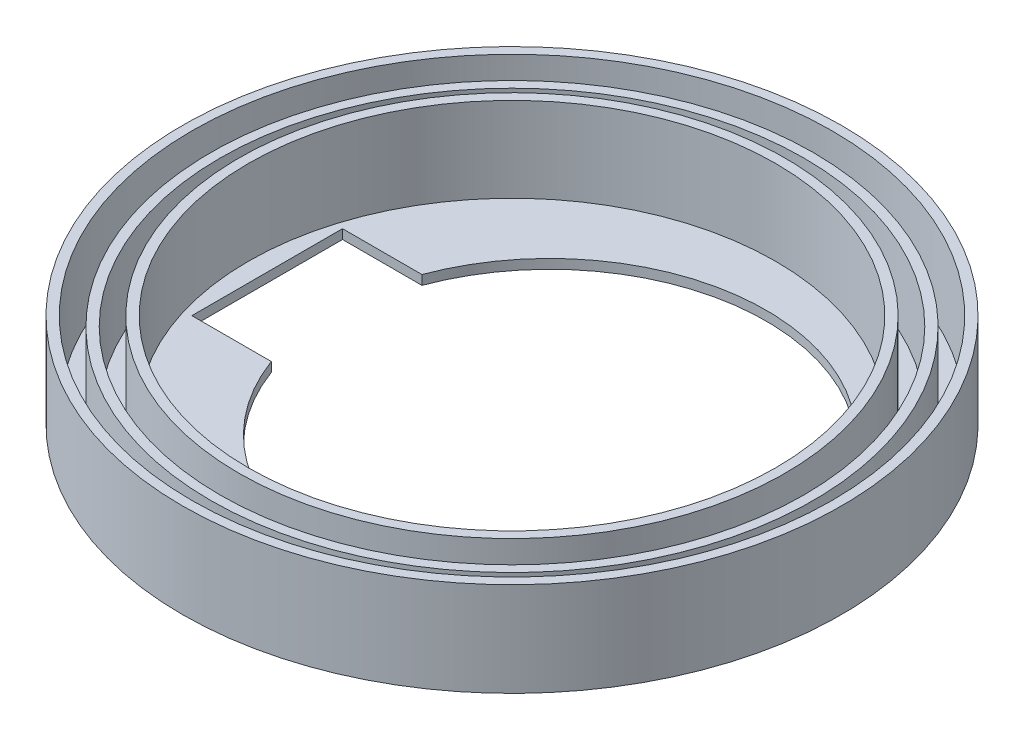
ISO-10303-21;
HEADER;
FILE_DESCRIPTION(('STEP AP214'),'2;1');
FILE_NAME('part.step','',(''),(''),'','','');
FILE_SCHEMA(('AUTOMOTIVE_DESIGN { 1 0 10303 214 1 1 1 1 }'));
ENDSEC;
DATA;
#1=APPLICATION_CONTEXT('core data for automotive mechanical design processes');
#2=APPLICATION_PROTOCOL_DEFINITION('international standard','automotive_design',2000,#1);
#3=PRODUCT_CONTEXT('',#1,'mechanical');
#4=PRODUCT('Part','Part','',(#3));
#5=PRODUCT_RELATED_PRODUCT_CATEGORY('part','',(#4));
#6=PRODUCT_DEFINITION_FORMATION('','',#4);
#7=PRODUCT_DEFINITION_CONTEXT('part definition',#1,'design');
#8=PRODUCT_DEFINITION('design','',#6,#7);
#9=PRODUCT_DEFINITION_SHAPE('','',#8);
#10=(LENGTH_UNIT() NAMED_UNIT(*) SI_UNIT(.MILLI.,.METRE.));
#11=(NAMED_UNIT(*) PLANE_ANGLE_UNIT() SI_UNIT($,.RADIAN.));
#12=(NAMED_UNIT(*) SI_UNIT($,.STERADIAN.) SOLID_ANGLE_UNIT());
#13=UNCERTAINTY_MEASURE_WITH_UNIT(LENGTH_MEASURE(1.E-05),#10,'distance_accuracy_value','');
#14=(GEOMETRIC_REPRESENTATION_CONTEXT(3) GLOBAL_UNCERTAINTY_ASSIGNED_CONTEXT((#13)) GLOBAL_UNIT_ASSIGNED_CONTEXT((#10,
#11,#12)) REPRESENTATION_CONTEXT('',''));
#15=CARTESIAN_POINT('',(0.,0.,0.));
#16=DIRECTION('',(0.,0.,1.));
#17=DIRECTION('',(1.,0.,0.));
#18=AXIS2_PLACEMENT_3D('',#15,#16,#17);
#19=CARTESIAN_POINT('',(0.,0.5,0.));
#20=DIRECTION('',(0.,1.,0.));
#21=DIRECTION('',(0.,0.,1.));
#22=AXIS2_PLACEMENT_3D('',#19,#20,#21);
#23=PLANE('',#22);
#24=CARTESIAN_POINT('',(0.,0.5,0.));
#25=DIRECTION('',(0.,1.,0.));
#26=DIRECTION('',(0.,0.,1.));
#27=AXIS2_PLACEMENT_3D('',#24,#25,#26);
#28=CIRCLE('',#27,16.);
#29=CARTESIAN_POINT('',(0.,0.5,16.));
#30=VERTEX_POINT('',#29);
#31=EDGE_CURVE('E101',#30,#30,#28,.F.);
#32=ORIENTED_EDGE('',*,*,#31,.T.);
#33=EDGE_LOOP('',(#32));
#34=FACE_BOUND('',#33,.T.);
#35=CARTESIAN_POINT('',(0.,0.5,0.));
#36=DIRECTION('',(0.,1.,0.));
#37=DIRECTION('',(0.,0.,1.));
#38=AXIS2_PLACEMENT_3D('',#35,#36,#37);
#39=CIRCLE('',#38,17.);
#40=CARTESIAN_POINT('',(0.,0.5,17.));
#41=VERTEX_POINT('',#40);
#42=EDGE_CURVE('E12',#41,#41,#39,.F.);
#43=ORIENTED_EDGE('',*,*,#42,.F.);
#44=EDGE_LOOP('',(#43));
#45=FACE_BOUND('',#44,.T.);
#46=ADVANCED_FACE('F39',(#34,#45),#23,.T.);
#47=DIRECTION('',(0.,0.,-1.));
#48=VECTOR('',#47,1.);
#49=CARTESIAN_POINT('',(-13.,0.5,0.));
#50=LINE('',#49,#48);
#51=CARTESIAN_POINT('',(-13.,0.5,4.));
#52=VERTEX_POINT('',#51);
#53=CARTESIAN_POINT('',(-13.,0.5,-4.));
#54=VERTEX_POINT('',#53);
#55=EDGE_CURVE('E112',#52,#54,#50,.T.);
#56=ORIENTED_EDGE('',*,*,#55,.T.);
#57=DIRECTION('',(1.,0.,0.));
#58=VECTOR('',#57,1.);
#59=CARTESIAN_POINT('',(0.,0.5,-4.));
#60=LINE('',#59,#58);
#61=CARTESIAN_POINT('',(-8.78192932642392,0.5,-4.));
#62=VERTEX_POINT('',#61);
#63=EDGE_CURVE('E84',#54,#62,#60,.T.);
#64=ORIENTED_EDGE('',*,*,#63,.T.);
#65=CARTESIAN_POINT('',(2.,0.5,0.));
#66=DIRECTION('',(0.,1.,0.));
#67=DIRECTION('',(0.,0.,1.));
#68=AXIS2_PLACEMENT_3D('',#65,#66,#67);
#69=CIRCLE('',#68,11.5);
#70=CARTESIAN_POINT('',(-8.78192932642392,0.5,4.));
#71=VERTEX_POINT('',#70);
#72=EDGE_CURVE('E114',#71,#62,#69,.T.);
#73=ORIENTED_EDGE('',*,*,#72,.F.);
#74=DIRECTION('',(-1.,0.,0.));
#75=VECTOR('',#74,1.);
#76=CARTESIAN_POINT('',(0.,0.5,4.));
#77=LINE('',#76,#75);
#78=EDGE_CURVE('E54',#71,#52,#77,.T.);
#79=ORIENTED_EDGE('',*,*,#78,.T.);
#80=EDGE_LOOP('',(#56,#64,#73,#79));
#81=FACE_BOUND('',#80,.T.);
#82=CARTESIAN_POINT('',(0.,0.5,0.));
#83=DIRECTION('',(0.,1.,0.));
#84=DIRECTION('',(0.,0.,1.));
#85=AXIS2_PLACEMENT_3D('',#82,#83,#84);
#86=CIRCLE('',#85,14.);
#87=CARTESIAN_POINT('',(0.,0.5,14.));
#88=VERTEX_POINT('',#87);
#89=EDGE_CURVE('E47',#88,#88,#86,.F.);
#90=ORIENTED_EDGE('',*,*,#89,.F.);
#91=EDGE_LOOP('',(#90));
#92=FACE_BOUND('',#91,.T.);
#93=ADVANCED_FACE('F169',(#81,#92),#23,.T.);
#94=CARTESIAN_POINT('',(0.,0.5,0.));
#95=DIRECTION('',(0.,1.,0.));
#96=DIRECTION('',(0.,0.,1.));
#97=AXIS2_PLACEMENT_3D('',#94,#95,#96);
#98=CIRCLE('',#97,14.5);
#99=CARTESIAN_POINT('',(0.,0.5,14.5));
#100=VERTEX_POINT('',#99);
#101=EDGE_CURVE('E137',#100,#100,#98,.T.);
#102=ORIENTED_EDGE('',*,*,#101,.F.);
#103=EDGE_LOOP('',(#102));
#104=FACE_BOUND('',#103,.T.);
#105=CARTESIAN_POINT('',(0.,0.5,0.));
#106=DIRECTION('',(0.,1.,0.));
#107=DIRECTION('',(0.,0.,1.));
#108=AXIS2_PLACEMENT_3D('',#105,#106,#107);
#109=CIRCLE('',#108,15.5);
#110=CARTESIAN_POINT('',(0.,0.5,15.5));
#111=VERTEX_POINT('',#110);
#112=EDGE_CURVE('E123',#111,#111,#109,.F.);
#113=ORIENTED_EDGE('',*,*,#112,.F.);
#114=EDGE_LOOP('',(#113));
#115=FACE_BOUND('',#114,.T.);
#116=ADVANCED_FACE('F172',(#104,#115),#23,.T.);
#117=CARTESIAN_POINT('',(0.,0.,0.));
#118=DIRECTION('',(0.,1.,0.));
#119=DIRECTION('',(0.,0.,1.));
#120=AXIS2_PLACEMENT_3D('',#117,#118,#119);
#121=PLANE('',#120);
#122=CARTESIAN_POINT('',(0.,0.,0.));
#123=DIRECTION('',(0.,1.,0.));
#124=DIRECTION('',(0.,0.,1.));
#125=AXIS2_PLACEMENT_3D('',#122,#123,#124);
#126=CIRCLE('',#125,17.5);
#127=CARTESIAN_POINT('',(0.,0.,17.5));
#128=VERTEX_POINT('',#127);
#129=EDGE_CURVE('E116',#128,#128,#126,.T.);
#130=ORIENTED_EDGE('',*,*,#129,.F.);
#131=EDGE_LOOP('',(#130));
#132=FACE_BOUND('',#131,.T.);
#133=DIRECTION('',(-1.,0.,0.));
#134=VECTOR('',#133,1.);
#135=CARTESIAN_POINT('',(2.,0.,-4.));
#136=LINE('',#135,#134);
#137=CARTESIAN_POINT('',(-8.78192932642392,0.,-4.));
#138=VERTEX_POINT('',#137);
#139=CARTESIAN_POINT('',(-13.,0.,-4.));
#140=VERTEX_POINT('',#139);
#141=EDGE_CURVE('E83',#138,#140,#136,.T.);
#142=ORIENTED_EDGE('',*,*,#141,.T.);
#143=DIRECTION('',(0.,0.,1.));
#144=VECTOR('',#143,1.);
#145=CARTESIAN_POINT('',(-13.,0.,-4.));
#146=LINE('',#145,#144);
#147=CARTESIAN_POINT('',(-13.,0.,4.));
#148=VERTEX_POINT('',#147);
#149=EDGE_CURVE('E90',#140,#148,#146,.T.);
#150=ORIENTED_EDGE('',*,*,#149,.T.);
#151=DIRECTION('',(1.,0.,0.));
#152=VECTOR('',#151,1.);
#153=CARTESIAN_POINT('',(2.,0.,4.));
#154=LINE('',#153,#152);
#155=CARTESIAN_POINT('',(-8.78192932642391,0.,4.));
#156=VERTEX_POINT('',#155);
#157=EDGE_CURVE('E95',#148,#156,#154,.T.);
#158=ORIENTED_EDGE('',*,*,#157,.T.);
#159=CARTESIAN_POINT('',(2.,0.,0.));
#160=DIRECTION('',(0.,1.,0.));
#161=DIRECTION('',(0.,0.,1.));
#162=AXIS2_PLACEMENT_3D('',#159,#160,#161);
#163=CIRCLE('',#162,11.5);
#164=EDGE_CURVE('E100',#156,#138,#163,.T.);
#165=ORIENTED_EDGE('',*,*,#164,.T.);
#166=EDGE_LOOP('',(#142,#150,#158,#165));
#167=FACE_BOUND('',#166,.T.);
#168=ADVANCED_FACE('F98',(#132,#167),#121,.F.);
#169=CARTESIAN_POINT('',(2.,0.,0.));
#170=DIRECTION('',(0.,1.,0.));
#171=DIRECTION('',(0.,0.,1.));
#172=AXIS2_PLACEMENT_3D('',#169,#170,#171);
#173=CYLINDRICAL_SURFACE('',#172,11.5);
#174=DIRECTION('',(0.,1.,0.));
#175=VECTOR('',#174,1.);
#176=CARTESIAN_POINT('',(-8.78192932642392,0.,-4.));
#177=LINE('',#176,#175);
#178=EDGE_CURVE('E62',#138,#62,#177,.T.);
#179=ORIENTED_EDGE('',*,*,#178,.F.);
#180=ORIENTED_EDGE('',*,*,#164,.F.);
#181=DIRECTION('',(0.,1.,0.));
#182=VECTOR('',#181,1.);
#183=CARTESIAN_POINT('',(-8.78192932642392,0.,4.));
#184=LINE('',#183,#182);
#185=EDGE_CURVE('E121',#71,#156,#184,.F.);
#186=ORIENTED_EDGE('',*,*,#185,.F.);
#187=ORIENTED_EDGE('',*,*,#72,.T.);
#188=EDGE_LOOP('',(#179,#180,#186,#187));
#189=FACE_BOUND('',#188,.T.);
#190=ADVANCED_FACE('F184',(#189),#173,.F.);
#191=CARTESIAN_POINT('',(0.,0.5,0.));
#192=DIRECTION('',(0.,-1.,0.));
#193=DIRECTION('',(0.,0.,-1.));
#194=AXIS2_PLACEMENT_3D('',#191,#192,#193);
#195=CYLINDRICAL_SURFACE('',#194,17.5);
#196=ORIENTED_EDGE('',*,*,#129,.T.);
#197=EDGE_LOOP('',(#196));
#198=FACE_BOUND('',#197,.T.);
#199=CARTESIAN_POINT('',(0.,5.,0.));
#200=DIRECTION('',(0.,1.,0.));
#201=DIRECTION('',(0.,0.,1.));
#202=AXIS2_PLACEMENT_3D('',#199,#200,#201);
#203=CIRCLE('',#202,17.5);
#204=CARTESIAN_POINT('',(0.,5.,17.5));
#205=VERTEX_POINT('',#204);
#206=EDGE_CURVE('E145',#205,#205,#203,.T.);
#207=ORIENTED_EDGE('',*,*,#206,.F.);
#208=EDGE_LOOP('',(#207));
#209=FACE_BOUND('',#208,.T.);
#210=ADVANCED_FACE('F41',(#198,#209),#195,.T.);
#211=CARTESIAN_POINT('',(2.,2.5,-4.));
#212=DIRECTION('',(0.,0.,1.));
#213=DIRECTION('',(1.,0.,0.));
#214=AXIS2_PLACEMENT_3D('',#211,#212,#213);
#215=PLANE('',#214);
#216=DIRECTION('',(0.,-1.,0.));
#217=VECTOR('',#216,1.);
#218=CARTESIAN_POINT('',(-13.,2.5,-4.));
#219=LINE('',#218,#217);
#220=EDGE_CURVE('E79',#54,#140,#219,.T.);
#221=ORIENTED_EDGE('',*,*,#220,.T.);
#222=ORIENTED_EDGE('',*,*,#141,.F.);
#223=ORIENTED_EDGE('',*,*,#178,.T.);
#224=ORIENTED_EDGE('',*,*,#63,.F.);
#225=EDGE_LOOP('',(#221,#222,#223,#224));
#226=FACE_BOUND('',#225,.T.);
#227=ADVANCED_FACE('F81',(#226),#215,.T.);
#228=CARTESIAN_POINT('',(-13.,2.5,-4.));
#229=DIRECTION('',(1.,0.,0.));
#230=DIRECTION('',(0.,0.,-1.));
#231=AXIS2_PLACEMENT_3D('',#228,#229,#230);
#232=PLANE('',#231);
#233=DIRECTION('',(0.,-1.,0.));
#234=VECTOR('',#233,1.);
#235=CARTESIAN_POINT('',(-13.,2.5,4.));
#236=LINE('',#235,#234);
#237=EDGE_CURVE('E87',#52,#148,#236,.T.);
#238=ORIENTED_EDGE('',*,*,#237,.T.);
#239=ORIENTED_EDGE('',*,*,#149,.F.);
#240=ORIENTED_EDGE('',*,*,#220,.F.);
#241=ORIENTED_EDGE('',*,*,#55,.F.);
#242=EDGE_LOOP('',(#238,#239,#240,#241));
#243=FACE_BOUND('',#242,.T.);
#244=ADVANCED_FACE('F91',(#243),#232,.T.);
#245=CARTESIAN_POINT('',(2.,2.5,4.));
#246=DIRECTION('',(0.,0.,-1.));
#247=DIRECTION('',(-1.,0.,0.));
#248=AXIS2_PLACEMENT_3D('',#245,#246,#247);
#249=PLANE('',#248);
#250=ORIENTED_EDGE('',*,*,#185,.T.);
#251=ORIENTED_EDGE('',*,*,#157,.F.);
#252=ORIENTED_EDGE('',*,*,#237,.F.);
#253=ORIENTED_EDGE('',*,*,#78,.F.);
#254=EDGE_LOOP('',(#250,#251,#252,#253));
#255=FACE_BOUND('',#254,.T.);
#256=ADVANCED_FACE('F207',(#255),#249,.T.);
#257=CARTESIAN_POINT('',(0.,4.5,0.));
#258=DIRECTION('',(0.,1.,0.));
#259=DIRECTION('',(0.,0.,1.));
#260=AXIS2_PLACEMENT_3D('',#257,#258,#259);
#261=PLANE('',#260);
#262=CARTESIAN_POINT('',(0.,4.5,0.));
#263=DIRECTION('',(0.,1.,0.));
#264=DIRECTION('',(0.,0.,1.));
#265=AXIS2_PLACEMENT_3D('',#262,#263,#264);
#266=CIRCLE('',#265,16.);
#267=CARTESIAN_POINT('',(0.,4.5,16.));
#268=VERTEX_POINT('',#267);
#269=EDGE_CURVE('E104',#268,#268,#266,.T.);
#270=ORIENTED_EDGE('',*,*,#269,.T.);
#271=EDGE_LOOP('',(#270));
#272=FACE_BOUND('',#271,.T.);
#273=CARTESIAN_POINT('',(0.,4.5,0.));
#274=DIRECTION('',(0.,1.,0.));
#275=DIRECTION('',(0.,0.,1.));
#276=AXIS2_PLACEMENT_3D('',#273,#274,#275);
#277=CIRCLE('',#276,15.5);
#278=CARTESIAN_POINT('',(0.,4.5,15.5));
#279=VERTEX_POINT('',#278);
#280=EDGE_CURVE('E133',#279,#279,#277,.T.);
#281=ORIENTED_EDGE('',*,*,#280,.F.);
#282=EDGE_LOOP('',(#281));
#283=FACE_BOUND('',#282,.T.);
#284=ADVANCED_FACE('F204',(#272,#283),#261,.T.);
#285=CARTESIAN_POINT('',(0.,4.5,0.));
#286=DIRECTION('',(0.,-1.,0.));
#287=DIRECTION('',(0.,0.,-1.));
#288=AXIS2_PLACEMENT_3D('',#285,#286,#287);
#289=CYLINDRICAL_SURFACE('',#288,16.);
#290=ORIENTED_EDGE('',*,*,#31,.F.);
#291=EDGE_LOOP('',(#290));
#292=FACE_BOUND('',#291,.T.);
#293=ORIENTED_EDGE('',*,*,#269,.F.);
#294=EDGE_LOOP('',(#293));
#295=FACE_BOUND('',#294,.T.);
#296=ADVANCED_FACE('F203',(#292,#295),#289,.T.);
#297=CARTESIAN_POINT('',(0.,4.5,0.));
#298=DIRECTION('',(0.,-1.,0.));
#299=DIRECTION('',(0.,0.,-1.));
#300=AXIS2_PLACEMENT_3D('',#297,#298,#299);
#301=CYLINDRICAL_SURFACE('',#300,15.5);
#302=ORIENTED_EDGE('',*,*,#112,.T.);
#303=EDGE_LOOP('',(#302));
#304=FACE_BOUND('',#303,.T.);
#305=ORIENTED_EDGE('',*,*,#280,.T.);
#306=EDGE_LOOP('',(#305));
#307=FACE_BOUND('',#306,.T.);
#308=ADVANCED_FACE('F196',(#304,#307),#301,.F.);
#309=CARTESIAN_POINT('',(0.,5.,0.));
#310=DIRECTION('',(0.,1.,0.));
#311=DIRECTION('',(0.,0.,1.));
#312=AXIS2_PLACEMENT_3D('',#309,#310,#311);
#313=PLANE('',#312);
#314=CARTESIAN_POINT('',(0.,5.,0.));
#315=DIRECTION('',(0.,1.,0.));
#316=DIRECTION('',(0.,0.,1.));
#317=AXIS2_PLACEMENT_3D('',#314,#315,#316);
#318=CIRCLE('',#317,14.5);
#319=CARTESIAN_POINT('',(0.,5.,14.5));
#320=VERTEX_POINT('',#319);
#321=EDGE_CURVE('E136',#320,#320,#318,.T.);
#322=ORIENTED_EDGE('',*,*,#321,.T.);
#323=EDGE_LOOP('',(#322));
#324=FACE_BOUND('',#323,.T.);
#325=CARTESIAN_POINT('',(0.,5.,0.));
#326=DIRECTION('',(0.,1.,0.));
#327=DIRECTION('',(0.,0.,1.));
#328=AXIS2_PLACEMENT_3D('',#325,#326,#327);
#329=CIRCLE('',#328,14.);
#330=CARTESIAN_POINT('',(0.,5.,14.));
#331=VERTEX_POINT('',#330);
#332=EDGE_CURVE('E140',#331,#331,#329,.T.);
#333=ORIENTED_EDGE('',*,*,#332,.F.);
#334=EDGE_LOOP('',(#333));
#335=FACE_BOUND('',#334,.T.);
#336=ADVANCED_FACE('F190',(#324,#335),#313,.T.);
#337=CARTESIAN_POINT('',(0.,5.,0.));
#338=DIRECTION('',(0.,-1.,0.));
#339=DIRECTION('',(0.,0.,-1.));
#340=AXIS2_PLACEMENT_3D('',#337,#338,#339);
#341=CYLINDRICAL_SURFACE('',#340,14.5);
#342=ORIENTED_EDGE('',*,*,#321,.F.);
#343=EDGE_LOOP('',(#342));
#344=FACE_BOUND('',#343,.T.);
#345=ORIENTED_EDGE('',*,*,#101,.T.);
#346=EDGE_LOOP('',(#345));
#347=FACE_BOUND('',#346,.T.);
#348=ADVANCED_FACE('F165',(#344,#347),#341,.T.);
#349=CARTESIAN_POINT('',(0.,5.,0.));
#350=DIRECTION('',(0.,-1.,0.));
#351=DIRECTION('',(0.,0.,-1.));
#352=AXIS2_PLACEMENT_3D('',#349,#350,#351);
#353=CYLINDRICAL_SURFACE('',#352,14.);
#354=ORIENTED_EDGE('',*,*,#332,.T.);
#355=EDGE_LOOP('',(#354));
#356=FACE_BOUND('',#355,.T.);
#357=ORIENTED_EDGE('',*,*,#89,.T.);
#358=EDGE_LOOP('',(#357));
#359=FACE_BOUND('',#358,.T.);
#360=ADVANCED_FACE('F157',(#356,#359),#353,.F.);
#361=CARTESIAN_POINT('',(0.,5.,0.));
#362=DIRECTION('',(0.,1.,0.));
#363=DIRECTION('',(0.,0.,1.));
#364=AXIS2_PLACEMENT_3D('',#361,#362,#363);
#365=PLANE('',#364);
#366=ORIENTED_EDGE('',*,*,#206,.T.);
#367=EDGE_LOOP('',(#366));
#368=FACE_BOUND('',#367,.T.);
#369=CARTESIAN_POINT('',(0.,5.,0.));
#370=DIRECTION('',(0.,1.,0.));
#371=DIRECTION('',(0.,0.,1.));
#372=AXIS2_PLACEMENT_3D('',#369,#370,#371);
#373=CIRCLE('',#372,17.);
#374=CARTESIAN_POINT('',(0.,5.,17.));
#375=VERTEX_POINT('',#374);
#376=EDGE_CURVE('E148',#375,#375,#373,.T.);
#377=ORIENTED_EDGE('',*,*,#376,.F.);
#378=EDGE_LOOP('',(#377));
#379=FACE_BOUND('',#378,.T.);
#380=ADVANCED_FACE('F155',(#368,#379),#365,.T.);
#381=CARTESIAN_POINT('',(0.,5.,0.));
#382=DIRECTION('',(0.,-1.,0.));
#383=DIRECTION('',(0.,0.,-1.));
#384=AXIS2_PLACEMENT_3D('',#381,#382,#383);
#385=CYLINDRICAL_SURFACE('',#384,17.);
#386=ORIENTED_EDGE('',*,*,#376,.T.);
#387=EDGE_LOOP('',(#386));
#388=FACE_BOUND('',#387,.T.);
#389=ORIENTED_EDGE('',*,*,#42,.T.);
#390=EDGE_LOOP('',(#389));
#391=FACE_BOUND('',#390,.T.);
#392=ADVANCED_FACE('F152',(#388,#391),#385,.F.);
#393=CLOSED_SHELL('',(#46,#93,#116,#168,#190,#210,#227,#244,#256,#284,#296,#308,#336,#348,#360,
#380,#392));
#394=MANIFOLD_SOLID_BREP('B2',#393);
#395=ADVANCED_BREP_SHAPE_REPRESENTATION('',(#18,#394),#14);
#396=SHAPE_DEFINITION_REPRESENTATION(#9,#395);
ENDSEC;
END-ISO-10303-21;
